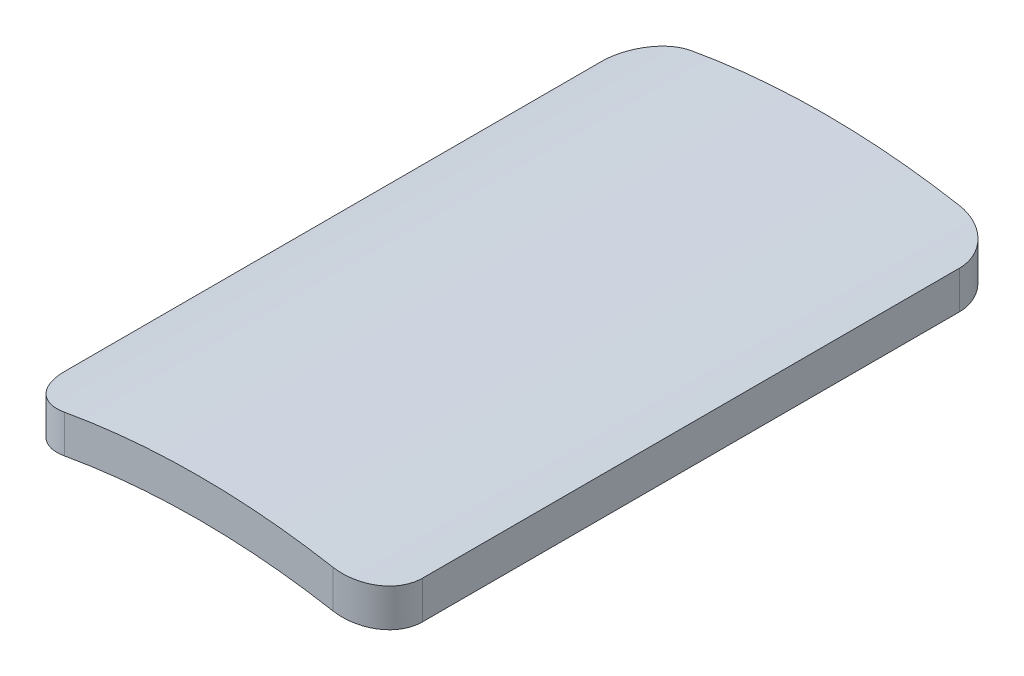
ISO-10303-21;
HEADER;
FILE_DESCRIPTION(('STEP AP214'),'2;1');
FILE_NAME('part.step','',(''),(''),'','','');
FILE_SCHEMA(('AUTOMOTIVE_DESIGN { 1 0 10303 214 1 1 1 1 }'));
ENDSEC;
DATA;
#1=APPLICATION_CONTEXT('core data for automotive mechanical design processes');
#2=APPLICATION_PROTOCOL_DEFINITION('international standard','automotive_design',2000,#1);
#3=PRODUCT_CONTEXT('',#1,'mechanical');
#4=PRODUCT('Part','Part','',(#3));
#5=PRODUCT_RELATED_PRODUCT_CATEGORY('part','',(#4));
#6=PRODUCT_DEFINITION_FORMATION('','',#4);
#7=PRODUCT_DEFINITION_CONTEXT('part definition',#1,'design');
#8=PRODUCT_DEFINITION('design','',#6,#7);
#9=PRODUCT_DEFINITION_SHAPE('','',#8);
#10=(LENGTH_UNIT() NAMED_UNIT(*) SI_UNIT(.MILLI.,.METRE.));
#11=(NAMED_UNIT(*) PLANE_ANGLE_UNIT() SI_UNIT($,.RADIAN.));
#12=(NAMED_UNIT(*) SI_UNIT($,.STERADIAN.) SOLID_ANGLE_UNIT());
#13=UNCERTAINTY_MEASURE_WITH_UNIT(LENGTH_MEASURE(1.E-05),#10,'distance_accuracy_value','');
#14=(GEOMETRIC_REPRESENTATION_CONTEXT(3) GLOBAL_UNCERTAINTY_ASSIGNED_CONTEXT((#13)) GLOBAL_UNIT_ASSIGNED_CONTEXT((#10,
#11,#12)) REPRESENTATION_CONTEXT('',''));
#15=CARTESIAN_POINT('',(0.,0.,0.));
#16=DIRECTION('',(0.,0.,1.));
#17=DIRECTION('',(1.,0.,0.));
#18=AXIS2_PLACEMENT_3D('',#15,#16,#17);
#19=CARTESIAN_POINT('',(0.,12.6999999999999,210.));
#20=DIRECTION('',(0.,0.,-1.));
#21=DIRECTION('',(-1.,0.,0.));
#22=AXIS2_PLACEMENT_3D('',#19,#20,#21);
#23=CYLINDRICAL_SURFACE('',#22,254.);
#24=DIRECTION('',(0.,0.,-1.));
#25=VECTOR('',#24,1.);
#26=CARTESIAN_POINT('',(60.0000000000001,259.511669092043,210.));
#27=LINE('',#26,#25);
#28=CARTESIAN_POINT('',(60.0000000000001,259.511669092043,195.));
#29=VERTEX_POINT('',#28);
#30=CARTESIAN_POINT('',(60.0000000000001,259.511669092043,15.));
#31=VERTEX_POINT('',#30);
#32=EDGE_CURVE('E109',#29,#31,#27,.T.);
#33=ORIENTED_EDGE('',*,*,#32,.T.);
#34=CARTESIAN_POINT('',(60.0000000000001,259.511669092043,15.));
#35=CARTESIAN_POINT('',(60.0000001541794,259.51166867937,14.7930484848678));
#36=CARTESIAN_POINT('',(59.9957163818266,259.512710488905,14.5861226501861));
#37=CARTESIAN_POINT('',(59.9785950952646,259.516871875848,14.1726475265372));
#38=CARTESIAN_POINT('',(59.9657576408849,259.519991438723,13.9660982349463));
#39=CARTESIAN_POINT('',(59.9144474939262,259.53245393191,13.347639174869));
#40=CARTESIAN_POINT('',(59.863176996449,259.544900676074,12.9367766933484));
#41=CARTESIAN_POINT('',(59.7270532099312,259.577872587751,12.1217380458237));
#42=CARTESIAN_POINT('',(59.6422553459561,259.598384422319,11.7175519858969));
#43=CARTESIAN_POINT('',(59.4397750877445,259.647208883795,10.9179720752957));
#44=CARTESIAN_POINT('',(59.3220926375575,259.675521523975,10.5225782395819));
#45=CARTESIAN_POINT('',(59.0547854199646,259.739574137433,9.74331719380976));
#46=CARTESIAN_POINT('',(58.9051569820494,259.775314964178,9.35945131406901));
#47=CARTESIAN_POINT('',(58.5751523710863,259.853758355402,8.6059071102114));
#48=CARTESIAN_POINT('',(58.3947756484712,259.89646104431,8.2362290398194));
#49=CARTESIAN_POINT('',(58.0046607614306,259.988292212507,7.51351632243513));
#50=CARTESIAN_POINT('',(57.794920793518,260.037421086479,7.16048269952465));
#51=CARTESIAN_POINT('',(57.3476657943594,260.14150404459,6.47338337486023));
#52=CARTESIAN_POINT('',(57.1101505738148,260.19645816843,6.13931780240358));
#53=CARTESIAN_POINT('',(56.6055769936013,260.312351403797,5.48775922496414));
#54=CARTESIAN_POINT('',(56.3381523527347,260.373363384628,5.17056284168507));
#55=CARTESIAN_POINT('',(55.778476451731,260.500007792394,4.55988535454695));
#56=CARTESIAN_POINT('',(55.4862249066143,260.565640272364,4.26640452298632));
#57=CARTESIAN_POINT('',(54.8788926943659,260.700814347405,3.70493266901083));
#58=CARTESIAN_POINT('',(54.5638065289835,260.770356883052,3.43694782183136));
#59=CARTESIAN_POINT('',(53.9130457262882,260.912599226453,2.9282064892944));
#60=CARTESIAN_POINT('',(53.5773710327311,260.985299042833,2.68745007832504));
#61=CARTESIAN_POINT('',(52.8789467609822,261.134996979243,2.22889560553249));
#62=CARTESIAN_POINT('',(52.5157264735411,261.212057347178,2.01183450881089));
#63=CARTESIAN_POINT('',(51.7725452212415,261.367946662358,1.60928583385435));
#64=CARTESIAN_POINT('',(51.39258380449,261.446775657316,1.4237991085638));
#65=CARTESIAN_POINT('',(50.618677620439,261.605414676664,1.08566435619933));
#66=CARTESIAN_POINT('',(50.2247373797523,261.685224378109,0.933005809762937));
#67=CARTESIAN_POINT('',(49.4254870919643,261.845112745394,0.661481210046061));
#68=CARTESIAN_POINT('',(49.0201792768898,261.925191355753,0.542608573225225));
#69=CARTESIAN_POINT('',(48.3156535427702,262.062563413024,0.367883533586442));
#70=CARTESIAN_POINT('',(48.0184909892975,262.119961388578,0.303704623937117));
#71=CARTESIAN_POINT('',(47.420740362565,262.234298157293,0.193502926802259));
#72=CARTESIAN_POINT('',(47.1201525797222,262.291236988694,0.147478611645022));
#73=CARTESIAN_POINT('',(46.5169924469798,262.404351888161,0.073817987090146));
#74=CARTESIAN_POINT('',(46.2144230844473,262.46052882908,0.04615851793122));
#75=CARTESIAN_POINT('',(45.6079379876144,262.571990135916,0.00924263422101381));
#76=CARTESIAN_POINT('',(45.3040219972827,262.627274321924,-1.01157437972733E-05));
#77=CARTESIAN_POINT('',(45.0000000000001,262.681999351953,0.));
#78=B_SPLINE_CURVE_WITH_KNOTS('',3,(#34,#35,#36,#37,#38,#39,#40,#41,#42,#43,#44,#45,#46,#47,#48,
#49,#50,#51,#52,#53,#54,#55,#56,#57,#58,#59,#60,#61,#62,#63,#64,#65,#66,#67,#68,#69,#70,#71,#72,
#73,#74,#75,#76,#77),.UNSPECIFIED.,.F.,.F.,(4,2,2,2,2,2,2,2,2,2,2,2,2,2,2,2,2,2,2,2,2,4),(0.,
0.620756384816884,1.24150842775672,2.48258932108984,3.72162706865398,4.96066692435903,
6.19984921914479,7.43905366428252,8.67833425463271,9.91762329162678,11.1742207186125,
12.4308325716133,13.6877480106077,14.9446668834145,16.2334577804403,17.5222834871083,
18.8106955889249,20.0988564576756,21.0264985534749,21.9540625734435,22.8804546167443,
23.8070310766212),.UNSPECIFIED.);
#79=CARTESIAN_POINT('',(45.0000000000001,262.681999351953,0.));
#80=VERTEX_POINT('',#79);
#81=EDGE_CURVE('E167',#31,#80,#78,.T.);
#82=ORIENTED_EDGE('',*,*,#81,.T.);
#83=CARTESIAN_POINT('',(0.,12.6999999999999,0.));
#84=DIRECTION('',(0.,0.,1.));
#85=DIRECTION('',(1.,0.,0.));
#86=AXIS2_PLACEMENT_3D('',#83,#84,#85);
#87=CIRCLE('',#86,254.);
#88=CARTESIAN_POINT('',(-45.0000000000001,262.681999351953,0.));
#89=VERTEX_POINT('',#88);
#90=EDGE_CURVE('E216',#80,#89,#87,.T.);
#91=ORIENTED_EDGE('',*,*,#90,.T.);
#92=CARTESIAN_POINT('',(-45.0000000000001,262.681999351953,0.));
#93=CARTESIAN_POINT('',(-45.4294376858986,262.604706476596,-4.15526219416858E-05));
#94=CARTESIAN_POINT('',(-45.8586585995018,262.526287639836,0.0184397316181787));
#95=CARTESIAN_POINT('',(-46.7136179739125,262.367830053483,0.0920404783760814));
#96=CARTESIAN_POINT('',(-47.1393566693072,262.287791414295,0.147157451924801));
#97=CARTESIAN_POINT('',(-47.9841383707825,262.126758164133,0.293583448301594));
#98=CARTESIAN_POINT('',(-48.4031847995897,262.04576408124,0.384873311004959));
#99=CARTESIAN_POINT('',(-49.2318714323198,261.883468556722,0.602958270625843));
#100=CARTESIAN_POINT('',(-49.6415116666793,261.802167116091,0.729753252638825));
#101=CARTESIAN_POINT('',(-50.4486730159223,261.639954526512,1.01802253217642));
#102=CARTESIAN_POINT('',(-50.8461892623375,261.559043545053,1.17951055688413));
#103=CARTESIAN_POINT('',(-51.6261295029793,261.398414329781,1.53603847527787));
#104=CARTESIAN_POINT('',(-52.0085535743438,261.318696089873,1.73107819744978));
#105=CARTESIAN_POINT('',(-52.7555331534634,261.161263405664,2.15337579832397));
#106=CARTESIAN_POINT('',(-53.1200914721124,261.083548647066,2.38062858676693));
#107=CARTESIAN_POINT('',(-53.8287715548229,260.930930297364,2.86586576061533));
#108=CARTESIAN_POINT('',(-54.1728934749816,260.85602668479,3.12384991124317));
#109=CARTESIAN_POINT('',(-54.8374336887313,260.710022710099,3.668231998109));
#110=CARTESIAN_POINT('',(-55.157903087529,260.638914245888,3.95456534548008));
#111=CARTESIAN_POINT('',(-55.7735696910984,260.501147023288,4.55419347775247));
#112=CARTESIAN_POINT('',(-56.0687667143355,260.434488296862,4.86748845629011));
#113=CARTESIAN_POINT('',(-56.631695424,260.306410311331,5.51902081185908));
#114=CARTESIAN_POINT('',(-56.8994227514114,260.244991884039,5.85726213289706));
#115=CARTESIAN_POINT('',(-57.2786684542124,260.15741245942,6.38136632626339));
#116=CARTESIAN_POINT('',(-57.4013630308583,260.128976519476,6.55886402125944));
#117=CARTESIAN_POINT('',(-57.6391231454316,260.073697826896,6.91920957596575));
#118=CARTESIAN_POINT('',(-57.7541865944734,260.046855510695,7.10205888100373));
#119=CARTESIAN_POINT('',(-58.0833582975446,259.969839818797,7.65115644336909));
#120=CARTESIAN_POINT('',(-58.2862299116384,259.922070653442,8.02457232252576));
#121=CARTESIAN_POINT('',(-58.6598124449476,259.833695144002,8.78790322010142));
#122=CARTESIAN_POINT('',(-58.8305241810681,259.793088617977,9.17781781912211));
#123=CARTESIAN_POINT('',(-59.1382797429383,259.71961239335,9.97109895078273));
#124=CARTESIAN_POINT('',(-59.2753498457593,259.686736657168,10.3744547031871));
#125=CARTESIAN_POINT('',(-59.5147664288372,259.629155247017,11.1917321107843));
#126=CARTESIAN_POINT('',(-59.6171237425834,259.604447024114,11.6056504260718));
#127=CARTESIAN_POINT('',(-59.8007900949181,259.560033406785,12.5128857047575));
#128=CARTESIAN_POINT('',(-59.8754836471939,259.541911557436,13.0076506714157));
#129=CARTESIAN_POINT('',(-59.9501806802361,259.523775970581,13.7532021150467));
#130=CARTESIAN_POINT('',(-59.9688557874932,259.519238651207,14.00215859031));
#131=CARTESIAN_POINT('',(-59.9937650541103,259.513184920042,14.5007267503782));
#132=CARTESIAN_POINT('',(-59.9999993645814,259.511668471558,14.7503384271879));
#133=CARTESIAN_POINT('',(-60.0000000000001,259.511669092043,15.));
#134=B_SPLINE_CURVE_WITH_KNOTS('',3,(#92,#93,#94,#95,#96,#97,#98,#99,#100,#101,#102,#103,#104,
#105,#106,#107,#108,#109,#110,#111,#112,#113,#114,#115,#116,#117,#118,#119,#120,#121,#122,#123,
#124,#125,#126,#127,#128,#129,#130,#131,#132,#133),.UNSPECIFIED.,.F.,.F.,(4,2,2,2,2,2,2,2,2,2,2,
2,2,2,2,2,2,2,2,2,4),(0.,1.3086019086928,2.61711492218899,3.92493576454784,5.23275237448009,
6.54108741146777,7.84941576052961,9.15753759954329,10.4656494455727,11.7708467156053,
13.076053360245,14.3814668017068,15.0342151643604,15.6871414740206,16.968358780115,
18.2495435371428,19.5297243685856,20.8095053008502,22.3086580764339,23.0574700448827,
23.8062729178976),.UNSPECIFIED.);
#135=CARTESIAN_POINT('',(-60.0000000000001,259.511669092043,15.));
#136=VERTEX_POINT('',#135);
#137=EDGE_CURVE('E162',#89,#136,#134,.T.);
#138=ORIENTED_EDGE('',*,*,#137,.T.);
#139=DIRECTION('',(0.,0.,-1.));
#140=VECTOR('',#139,1.);
#141=CARTESIAN_POINT('',(-60.0000000000001,259.511669092043,210.));
#142=LINE('',#141,#140);
#143=CARTESIAN_POINT('',(-60.0000000000001,259.511669092043,195.));
#144=VERTEX_POINT('',#143);
#145=EDGE_CURVE('E131',#144,#136,#142,.T.);
#146=ORIENTED_EDGE('',*,*,#145,.F.);
#147=CARTESIAN_POINT('',(-60.0000000000001,259.511669092043,195.));
#148=CARTESIAN_POINT('',(-60.0000001541795,259.51166867937,195.206951515132));
#149=CARTESIAN_POINT('',(-59.9957163818266,259.512710488905,195.413877349814));
#150=CARTESIAN_POINT('',(-59.9785950952647,259.516871875848,195.827352473463));
#151=CARTESIAN_POINT('',(-59.965757640885,259.519991438723,196.033901765054));
#152=CARTESIAN_POINT('',(-59.9144474939262,259.53245393191,196.652360825131));
#153=CARTESIAN_POINT('',(-59.863176996449,259.544900676074,197.063223306652));
#154=CARTESIAN_POINT('',(-59.7270532099313,259.577872587751,197.878261954176));
#155=CARTESIAN_POINT('',(-59.6422553459561,259.598384422319,198.282448014103));
#156=CARTESIAN_POINT('',(-59.4397750877445,259.647208883795,199.082027924704));
#157=CARTESIAN_POINT('',(-59.3220926375575,259.675521523975,199.477421760418));
#158=CARTESIAN_POINT('',(-59.0547854199646,259.739574137433,200.25668280619));
#159=CARTESIAN_POINT('',(-58.9051569820495,259.775314964178,200.640548685931));
#160=CARTESIAN_POINT('',(-58.5751523710864,259.853758355402,201.394092889789));
#161=CARTESIAN_POINT('',(-58.3947756484712,259.89646104431,201.763770960181));
#162=CARTESIAN_POINT('',(-58.0046607614307,259.988292212507,202.486483677565));
#163=CARTESIAN_POINT('',(-57.7949207935181,260.037421086479,202.839517300475));
#164=CARTESIAN_POINT('',(-57.3476657943595,260.14150404459,203.52661662514));
#165=CARTESIAN_POINT('',(-57.1101505738149,260.19645816843,203.860682197596));
#166=CARTESIAN_POINT('',(-56.6055769936014,260.312351403797,204.512240775036));
#167=CARTESIAN_POINT('',(-56.3381523527347,260.373363384628,204.829437158315));
#168=CARTESIAN_POINT('',(-55.7784764517311,260.500007792393,205.440114645453));
#169=CARTESIAN_POINT('',(-55.4862249066143,260.565640272364,205.733595477014));
#170=CARTESIAN_POINT('',(-54.8788926943659,260.700814347405,206.295067330989));
#171=CARTESIAN_POINT('',(-54.5638065289836,260.770356883052,206.563052178169));
#172=CARTESIAN_POINT('',(-53.9130457262882,260.912599226453,207.071793510706));
#173=CARTESIAN_POINT('',(-53.5773710327311,260.985299042833,207.312549921675));
#174=CARTESIAN_POINT('',(-52.8789467609823,261.134996979243,207.771104394467));
#175=CARTESIAN_POINT('',(-52.5157264735412,261.212057347178,207.988165491189));
#176=CARTESIAN_POINT('',(-51.7725452212415,261.367946662358,208.390714166146));
#177=CARTESIAN_POINT('',(-51.39258380449,261.446775657316,208.576200891436));
#178=CARTESIAN_POINT('',(-50.6186776204391,261.605414676664,208.914335643801));
#179=CARTESIAN_POINT('',(-50.2247373797523,261.685224378109,209.066994190237));
#180=CARTESIAN_POINT('',(-49.4254870919644,261.845112745394,209.338518789954));
#181=CARTESIAN_POINT('',(-49.0201792768899,261.925191355753,209.457391426775));
#182=CARTESIAN_POINT('',(-48.3156535427703,262.062563413024,209.632116466414));
#183=CARTESIAN_POINT('',(-48.0184909892976,262.119961388578,209.696295376063));
#184=CARTESIAN_POINT('',(-47.4207403625651,262.234298157293,209.806497073198));
#185=CARTESIAN_POINT('',(-47.1201525797223,262.291236988694,209.852521388355));
#186=CARTESIAN_POINT('',(-46.5169924469798,262.404351888161,209.92618201291));
#187=CARTESIAN_POINT('',(-46.2144230844473,262.46052882908,209.953841482069));
#188=CARTESIAN_POINT('',(-45.6079379876144,262.571990135916,209.990757365779));
#189=CARTESIAN_POINT('',(-45.3040219972827,262.627274321924,210.000010115744));
#190=CARTESIAN_POINT('',(-45.0000000000001,262.681999351953,210.));
#191=B_SPLINE_CURVE_WITH_KNOTS('',3,(#147,#148,#149,#150,#151,#152,#153,#154,#155,#156,#157,
#158,#159,#160,#161,#162,#163,#164,#165,#166,#167,#168,#169,#170,#171,#172,#173,#174,#175,#176,
#177,#178,#179,#180,#181,#182,#183,#184,#185,#186,#187,#188,#189,#190),.UNSPECIFIED.,.F.,.F.,(4,
2,2,2,2,2,2,2,2,2,2,2,2,2,2,2,2,2,2,2,2,4),(0.,0.62075638481688,1.24150842775672,
2.48258932108982,3.72162706865396,4.96066692435902,6.1998492191448,7.43905366428251,
8.67833425463267,9.91762329162676,11.1742207186125,12.4308325716133,13.6877480106077,
14.9446668834145,16.2334577804403,17.5222834871083,18.8106955889249,20.0988564576756,
21.0264985534749,21.9540625734435,22.8804546167443,23.8070310766212),.UNSPECIFIED.);
#192=CARTESIAN_POINT('',(-45.0000000000001,262.681999351953,210.));
#193=VERTEX_POINT('',#192);
#194=EDGE_CURVE('E116',#144,#193,#191,.T.);
#195=ORIENTED_EDGE('',*,*,#194,.T.);
#196=CARTESIAN_POINT('',(0.,12.6999999999999,210.));
#197=DIRECTION('',(0.,0.,1.));
#198=DIRECTION('',(1.,0.,0.));
#199=AXIS2_PLACEMENT_3D('',#196,#197,#198);
#200=CIRCLE('',#199,254.);
#201=CARTESIAN_POINT('',(45.0000000000001,262.681999351953,210.));
#202=VERTEX_POINT('',#201);
#203=EDGE_CURVE('E111',#202,#193,#200,.T.);
#204=ORIENTED_EDGE('',*,*,#203,.F.);
#205=CARTESIAN_POINT('',(45.0000000000001,262.681999351953,210.));
#206=CARTESIAN_POINT('',(45.4294376858986,262.604706476595,210.000041552622));
#207=CARTESIAN_POINT('',(45.8586585995018,262.526287639836,209.981560268382));
#208=CARTESIAN_POINT('',(46.7136179739125,262.367830053483,209.907959521624));
#209=CARTESIAN_POINT('',(47.1393566693072,262.287791414295,209.852842548075));
#210=CARTESIAN_POINT('',(47.9841383707825,262.126758164133,209.706416551698));
#211=CARTESIAN_POINT('',(48.4031847995896,262.04576408124,209.615126688995));
#212=CARTESIAN_POINT('',(49.2318714323198,261.883468556722,209.397041729374));
#213=CARTESIAN_POINT('',(49.6415116666793,261.802167116091,209.270246747361));
#214=CARTESIAN_POINT('',(50.4486730159223,261.639954526512,208.981977467824));
#215=CARTESIAN_POINT('',(50.8461892623375,261.559043545053,208.820489443116));
#216=CARTESIAN_POINT('',(51.6261295029792,261.398414329781,208.463961524722));
#217=CARTESIAN_POINT('',(52.0085535743438,261.318696089873,208.26892180255));
#218=CARTESIAN_POINT('',(52.7555331534633,261.161263405664,207.846624201676));
#219=CARTESIAN_POINT('',(53.1200914721124,261.083548647066,207.619371413233));
#220=CARTESIAN_POINT('',(53.8287715548228,260.930930297364,207.134134239385));
#221=CARTESIAN_POINT('',(54.1728934749815,260.85602668479,206.876150088757));
#222=CARTESIAN_POINT('',(54.8374336887312,260.710022710099,206.331768001891));
#223=CARTESIAN_POINT('',(55.1579030875289,260.638914245888,206.04543465452));
#224=CARTESIAN_POINT('',(55.7735696910983,260.501147023288,205.445806522248));
#225=CARTESIAN_POINT('',(56.0687667143355,260.434488296862,205.13251154371));
#226=CARTESIAN_POINT('',(56.6316954239999,260.306410311331,204.480979188141));
#227=CARTESIAN_POINT('',(56.8994227514114,260.244991884039,204.142737867103));
#228=CARTESIAN_POINT('',(57.2786684542123,260.15741245942,203.618633673737));
#229=CARTESIAN_POINT('',(57.4013630308582,260.128976519476,203.441135978741));
#230=CARTESIAN_POINT('',(57.6391231454315,260.073697826896,203.080790424034));
#231=CARTESIAN_POINT('',(57.7541865944734,260.046855510696,202.897941118996));
#232=CARTESIAN_POINT('',(58.0833582975446,259.969839818797,202.348843556631));
#233=CARTESIAN_POINT('',(58.2862299116383,259.922070653442,201.975427677474));
#234=CARTESIAN_POINT('',(58.6598124449475,259.833695144002,201.212096779899));
#235=CARTESIAN_POINT('',(58.830524181068,259.793088617977,200.822182180878));
#236=CARTESIAN_POINT('',(59.1382797429382,259.71961239335,200.028901049217));
#237=CARTESIAN_POINT('',(59.2753498457592,259.686736657168,199.625545296813));
#238=CARTESIAN_POINT('',(59.5147664288371,259.629155247017,198.808267889216));
#239=CARTESIAN_POINT('',(59.6171237425834,259.604447024114,198.394349573928));
#240=CARTESIAN_POINT('',(59.800790094918,259.560033406785,197.487114295243));
#241=CARTESIAN_POINT('',(59.8754836471939,259.541911557436,196.992349328584));
#242=CARTESIAN_POINT('',(59.9501806802361,259.523775970581,196.246797884953));
#243=CARTESIAN_POINT('',(59.9688557874931,259.519238651207,195.99784140969));
#244=CARTESIAN_POINT('',(59.9937650541102,259.513184920042,195.499273249622));
#245=CARTESIAN_POINT('',(59.9999993645813,259.511668471558,195.249661572812));
#246=CARTESIAN_POINT('',(60.,259.511669092043,195.));
#247=B_SPLINE_CURVE_WITH_KNOTS('',3,(#205,#206,#207,#208,#209,#210,#211,#212,#213,#214,#215,
#216,#217,#218,#219,#220,#221,#222,#223,#224,#225,#226,#227,#228,#229,#230,#231,#232,#233,#234,
#235,#236,#237,#238,#239,#240,#241,#242,#243,#244,#245,#246),.UNSPECIFIED.,.F.,.F.,(4,2,2,2,2,2,
2,2,2,2,2,2,2,2,2,2,2,2,2,2,4),(0.,1.30860190869279,2.61711492218898,3.92493576454782,
5.23275237448008,6.54108741146776,7.84941576052956,9.15753759954325,10.4656494455727,
11.7708467156053,13.0760533602449,14.3814668017067,15.0342151643603,15.6871414740205,
16.968358780115,18.2495435371427,19.5297243685855,20.8095053008502,22.3086580764339,
23.0574700448827,23.8062729178976),.UNSPECIFIED.);
#248=EDGE_CURVE('E107',#202,#29,#247,.T.);
#249=ORIENTED_EDGE('',*,*,#248,.T.);
#250=EDGE_LOOP('',(#33,#82,#91,#138,#146,#195,#204,#249));
#251=FACE_BOUND('',#250,.T.);
#252=ADVANCED_FACE('F39',(#251),#23,.T.);
#253=CARTESIAN_POINT('',(-60.0000000000001,259.511669092043,210.));
#254=DIRECTION('',(1.,0.,0.));
#255=DIRECTION('',(0.,0.,-1.));
#256=AXIS2_PLACEMENT_3D('',#253,#254,#255);
#257=PLANE('',#256);
#258=ORIENTED_EDGE('',*,*,#145,.T.);
#259=DIRECTION('',(0.,-1.,0.));
#260=VECTOR('',#259,1.);
#261=CARTESIAN_POINT('',(-60.0000000000001,259.511669092043,15.));
#262=LINE('',#261,#260);
#263=CARTESIAN_POINT('',(-60.0000000000001,246.811669092043,15.));
#264=VERTEX_POINT('',#263);
#265=EDGE_CURVE('E226',#136,#264,#262,.T.);
#266=ORIENTED_EDGE('',*,*,#265,.T.);
#267=DIRECTION('',(0.,0.,-1.));
#268=VECTOR('',#267,1.);
#269=CARTESIAN_POINT('',(-60.0000000000001,246.811669092043,210.));
#270=LINE('',#269,#268);
#271=CARTESIAN_POINT('',(-60.0000000000001,246.811669092043,195.));
#272=VERTEX_POINT('',#271);
#273=EDGE_CURVE('E135',#272,#264,#270,.T.);
#274=ORIENTED_EDGE('',*,*,#273,.F.);
#275=DIRECTION('',(0.,-1.,0.));
#276=VECTOR('',#275,1.);
#277=CARTESIAN_POINT('',(-60.0000000000001,259.511669092043,195.));
#278=LINE('',#277,#276);
#279=EDGE_CURVE('E225',#272,#144,#278,.F.);
#280=ORIENTED_EDGE('',*,*,#279,.T.);
#281=EDGE_LOOP('',(#258,#266,#274,#280));
#282=FACE_BOUND('',#281,.T.);
#283=ADVANCED_FACE('F153',(#282),#257,.F.);
#284=CARTESIAN_POINT('',(0.,0.,210.));
#285=DIRECTION('',(0.,0.,-1.));
#286=DIRECTION('',(-1.,0.,0.));
#287=AXIS2_PLACEMENT_3D('',#284,#285,#286);
#288=CYLINDRICAL_SURFACE('',#287,254.);
#289=CARTESIAN_POINT('',(0.,0.,0.));
#290=DIRECTION('',(0.,0.,-1.));
#291=DIRECTION('',(1.,0.,0.));
#292=AXIS2_PLACEMENT_3D('',#289,#290,#291);
#293=CIRCLE('',#292,254.);
#294=CARTESIAN_POINT('',(-45.0000000000001,249.981999351953,0.));
#295=VERTEX_POINT('',#294);
#296=CARTESIAN_POINT('',(45.,249.981999351953,0.));
#297=VERTEX_POINT('',#296);
#298=EDGE_CURVE('E222',#295,#297,#293,.T.);
#299=ORIENTED_EDGE('',*,*,#298,.T.);
#300=CARTESIAN_POINT('',(45.,249.981999351953,0.));
#301=CARTESIAN_POINT('',(45.4294376858985,249.904706476595,-4.1552621942158E-05));
#302=CARTESIAN_POINT('',(45.8586585995017,249.826287639836,0.0184397316181786));
#303=CARTESIAN_POINT('',(46.7136179739124,249.667830053483,0.0920404783760822));
#304=CARTESIAN_POINT('',(47.1393566693072,249.587791414295,0.147157451924802));
#305=CARTESIAN_POINT('',(47.9841383707824,249.426758164133,0.293583448301595));
#306=CARTESIAN_POINT('',(48.4031847995896,249.34576408124,0.384873311004958));
#307=CARTESIAN_POINT('',(49.2318714323198,249.183468556722,0.602958270625841));
#308=CARTESIAN_POINT('',(49.6415116666792,249.102167116091,0.729753252638825));
#309=CARTESIAN_POINT('',(50.4486730159222,248.939954526512,1.01802253217643));
#310=CARTESIAN_POINT('',(50.8461892623374,248.859043545053,1.17951055688414));
#311=CARTESIAN_POINT('',(51.6261295029792,248.698414329781,1.53603847527787));
#312=CARTESIAN_POINT('',(52.0085535743438,248.618696089873,1.73107819744977));
#313=CARTESIAN_POINT('',(52.7555331534633,248.461263405664,2.15337579832397));
#314=CARTESIAN_POINT('',(53.1200914721124,248.383548647066,2.38062858676692));
#315=CARTESIAN_POINT('',(53.8287715548228,248.230930297364,2.86586576061533));
#316=CARTESIAN_POINT('',(54.1728934749815,248.15602668479,3.12384991124318));
#317=CARTESIAN_POINT('',(54.8374336887312,248.010022710099,3.668231998109));
#318=CARTESIAN_POINT('',(55.1579030875289,247.938914245888,3.95456534548006));
#319=CARTESIAN_POINT('',(55.7735696910983,247.801147023288,4.55419347775245));
#320=CARTESIAN_POINT('',(56.0687667143354,247.734488296862,4.8674884562901));
#321=CARTESIAN_POINT('',(56.6316954239999,247.606410311331,5.51902081185908));
#322=CARTESIAN_POINT('',(56.8994227514114,247.544991884039,5.85726213289705));
#323=CARTESIAN_POINT('',(57.2786684542123,247.45741245942,6.38136632626339));
#324=CARTESIAN_POINT('',(57.4013630308582,247.428976519476,6.55886402125943));
#325=CARTESIAN_POINT('',(57.6391231454315,247.373697826896,6.91920957596574));
#326=CARTESIAN_POINT('',(57.7541865944734,247.346855510696,7.10205888100371));
#327=CARTESIAN_POINT('',(58.0833582975446,247.269839818797,7.65115644336908));
#328=CARTESIAN_POINT('',(58.2862299116383,247.222070653442,8.02457232252575));
#329=CARTESIAN_POINT('',(58.6598124449475,247.133695144002,8.78790322010142));
#330=CARTESIAN_POINT('',(58.830524181068,247.093088617977,9.17781781912211));
#331=CARTESIAN_POINT('',(59.1382797429382,247.01961239335,9.97109895078273));
#332=CARTESIAN_POINT('',(59.2753498457592,246.986736657168,10.3744547031871));
#333=CARTESIAN_POINT('',(59.5147664288371,246.929155247017,11.1917321107843));
#334=CARTESIAN_POINT('',(59.6171237425833,246.904447024114,11.6056504260718));
#335=CARTESIAN_POINT('',(59.800790094918,246.860033406785,12.5128857047575));
#336=CARTESIAN_POINT('',(59.8754836471939,246.841911557436,13.0076506714157));
#337=CARTESIAN_POINT('',(59.950180680236,246.823775970581,13.7532021150467));
#338=CARTESIAN_POINT('',(59.9688557874931,246.819238651207,14.00215859031));
#339=CARTESIAN_POINT('',(59.9937650541102,246.813184920042,14.5007267503783));
#340=CARTESIAN_POINT('',(59.9999993645813,246.811668471558,14.7503384271879));
#341=CARTESIAN_POINT('',(60.,246.811669092043,15.));
#342=B_SPLINE_CURVE_WITH_KNOTS('',3,(#300,#301,#302,#303,#304,#305,#306,#307,#308,#309,#310,
#311,#312,#313,#314,#315,#316,#317,#318,#319,#320,#321,#322,#323,#324,#325,#326,#327,#328,#329,
#330,#331,#332,#333,#334,#335,#336,#337,#338,#339,#340,#341),.UNSPECIFIED.,.F.,.F.,(4,2,2,2,2,2,
2,2,2,2,2,2,2,2,2,2,2,2,2,2,4),(0.,1.3086019086928,2.61711492218899,3.92493576454783,
5.23275237448009,6.54108741146777,7.8494157605296,9.15753759954328,10.4656494455727,
11.7708467156053,13.0760533602449,14.3814668017068,15.0342151643604,15.6871414740205,
16.968358780115,18.2495435371428,19.5297243685856,20.8095053008502,22.3086580764339,
23.0574700448827,23.8062729178976),.UNSPECIFIED.);
#343=CARTESIAN_POINT('',(60.,246.811669092043,15.));
#344=VERTEX_POINT('',#343);
#345=EDGE_CURVE('E186',#297,#344,#342,.T.);
#346=ORIENTED_EDGE('',*,*,#345,.T.);
#347=DIRECTION('',(0.,0.,-1.));
#348=VECTOR('',#347,1.);
#349=CARTESIAN_POINT('',(60.,246.811669092043,210.));
#350=LINE('',#349,#348);
#351=CARTESIAN_POINT('',(60.,246.811669092043,195.));
#352=VERTEX_POINT('',#351);
#353=EDGE_CURVE('E126',#352,#344,#350,.T.);
#354=ORIENTED_EDGE('',*,*,#353,.F.);
#355=CARTESIAN_POINT('',(60.,246.811669092043,195.));
#356=CARTESIAN_POINT('',(60.0000001541794,246.81166867937,195.206951515132));
#357=CARTESIAN_POINT('',(59.9957163818265,246.812710488905,195.413877349814));
#358=CARTESIAN_POINT('',(59.9785950952646,246.816871875848,195.827352473463));
#359=CARTESIAN_POINT('',(59.9657576408849,246.819991438723,196.033901765054));
#360=CARTESIAN_POINT('',(59.9144474939261,246.83245393191,196.652360825131));
#361=CARTESIAN_POINT('',(59.8631769964489,246.844900676074,197.063223306652));
#362=CARTESIAN_POINT('',(59.7270532099312,246.877872587751,197.878261954176));
#363=CARTESIAN_POINT('',(59.642255345956,246.898384422319,198.282448014103));
#364=CARTESIAN_POINT('',(59.4397750877445,246.947208883795,199.082027924704));
#365=CARTESIAN_POINT('',(59.3220926375574,246.975521523975,199.477421760418));
#366=CARTESIAN_POINT('',(59.0547854199645,247.039574137433,200.25668280619));
#367=CARTESIAN_POINT('',(58.9051569820494,247.075314964178,200.640548685931));
#368=CARTESIAN_POINT('',(58.5751523710863,247.153758355402,201.394092889789));
#369=CARTESIAN_POINT('',(58.3947756484711,247.19646104431,201.763770960181));
#370=CARTESIAN_POINT('',(58.0046607614306,247.288292212507,202.486483677565));
#371=CARTESIAN_POINT('',(57.794920793518,247.337421086479,202.839517300475));
#372=CARTESIAN_POINT('',(57.3476657943594,247.44150404459,203.52661662514));
#373=CARTESIAN_POINT('',(57.1101505738148,247.49645816843,203.860682197596));
#374=CARTESIAN_POINT('',(56.6055769936013,247.612351403797,204.512240775036));
#375=CARTESIAN_POINT('',(56.3381523527346,247.673363384628,204.829437158315));
#376=CARTESIAN_POINT('',(55.778476451731,247.800007792394,205.440114645453));
#377=CARTESIAN_POINT('',(55.4862249066142,247.865640272364,205.733595477014));
#378=CARTESIAN_POINT('',(54.8788926943658,248.000814347405,206.295067330989));
#379=CARTESIAN_POINT('',(54.5638065289835,248.070356883052,206.563052178169));
#380=CARTESIAN_POINT('',(53.9130457262881,248.212599226453,207.071793510706));
#381=CARTESIAN_POINT('',(53.577371032731,248.285299042833,207.312549921675));
#382=CARTESIAN_POINT('',(52.8789467609822,248.434996979243,207.771104394467));
#383=CARTESIAN_POINT('',(52.5157264735411,248.512057347178,207.988165491189));
#384=CARTESIAN_POINT('',(51.7725452212414,248.667946662358,208.390714166146));
#385=CARTESIAN_POINT('',(51.3925838044899,248.746775657316,208.576200891436));
#386=CARTESIAN_POINT('',(50.618677620439,248.905414676664,208.914335643801));
#387=CARTESIAN_POINT('',(50.2247373797522,248.985224378109,209.066994190237));
#388=CARTESIAN_POINT('',(49.4254870919643,249.145112745394,209.338518789954));
#389=CARTESIAN_POINT('',(49.0201792768898,249.225191355753,209.457391426775));
#390=CARTESIAN_POINT('',(48.3156535427702,249.362563413024,209.632116466414));
#391=CARTESIAN_POINT('',(48.0184909892975,249.419961388578,209.696295376063));
#392=CARTESIAN_POINT('',(47.420740362565,249.534298157293,209.806497073198));
#393=CARTESIAN_POINT('',(47.1201525797222,249.591236988694,209.852521388355));
#394=CARTESIAN_POINT('',(46.5169924469798,249.704351888162,209.92618201291));
#395=CARTESIAN_POINT('',(46.2144230844472,249.76052882908,209.953841482069));
#396=CARTESIAN_POINT('',(45.6079379876144,249.871990135916,209.990757365779));
#397=CARTESIAN_POINT('',(45.3040219972827,249.927274321924,210.000010115744));
#398=CARTESIAN_POINT('',(45.,249.981999351953,210.));
#399=B_SPLINE_CURVE_WITH_KNOTS('',3,(#355,#356,#357,#358,#359,#360,#361,#362,#363,#364,#365,
#366,#367,#368,#369,#370,#371,#372,#373,#374,#375,#376,#377,#378,#379,#380,#381,#382,#383,#384,
#385,#386,#387,#388,#389,#390,#391,#392,#393,#394,#395,#396,#397,#398),.UNSPECIFIED.,.F.,.F.,(4,
2,2,2,2,2,2,2,2,2,2,2,2,2,2,2,2,2,2,2,2,4),(0.,0.62075638481688,1.24150842775669,
2.48258932108979,3.72162706865396,4.96066692435902,6.1998492191448,7.43905366428251,
8.67833425463267,9.91762329162676,11.1742207186125,12.4308325716132,13.6877480106077,
14.9446668834145,16.2334577804403,17.5222834871083,18.8106955889249,20.0988564576756,
21.0264985534749,21.9540625734434,22.8804546167443,23.8070310766212),.UNSPECIFIED.);
#400=CARTESIAN_POINT('',(45.,249.981999351953,210.));
#401=VERTEX_POINT('',#400);
#402=EDGE_CURVE('E130',#352,#401,#399,.T.);
#403=ORIENTED_EDGE('',*,*,#402,.T.);
#404=CARTESIAN_POINT('',(0.,0.,210.));
#405=DIRECTION('',(0.,0.,-1.));
#406=DIRECTION('',(1.,0.,0.));
#407=AXIS2_PLACEMENT_3D('',#404,#405,#406);
#408=CIRCLE('',#407,254.);
#409=CARTESIAN_POINT('',(-45.0000000000001,249.981999351953,210.));
#410=VERTEX_POINT('',#409);
#411=EDGE_CURVE('E127',#410,#401,#408,.T.);
#412=ORIENTED_EDGE('',*,*,#411,.F.);
#413=CARTESIAN_POINT('',(-45.0000000000001,249.981999351953,210.));
#414=CARTESIAN_POINT('',(-45.4294376858986,249.904706476596,210.000041552622));
#415=CARTESIAN_POINT('',(-45.8586585995018,249.826287639836,209.981560268382));
#416=CARTESIAN_POINT('',(-46.7136179739125,249.667830053483,209.907959521624));
#417=CARTESIAN_POINT('',(-47.1393566693072,249.587791414295,209.852842548075));
#418=CARTESIAN_POINT('',(-47.9841383707825,249.426758164133,209.706416551698));
#419=CARTESIAN_POINT('',(-48.4031847995897,249.34576408124,209.615126688995));
#420=CARTESIAN_POINT('',(-49.2318714323198,249.183468556722,209.397041729374));
#421=CARTESIAN_POINT('',(-49.6415116666793,249.102167116091,209.270246747361));
#422=CARTESIAN_POINT('',(-50.4486730159223,248.939954526512,208.981977467824));
#423=CARTESIAN_POINT('',(-50.8461892623375,248.859043545053,208.820489443116));
#424=CARTESIAN_POINT('',(-51.6261295029793,248.698414329781,208.463961524722));
#425=CARTESIAN_POINT('',(-52.0085535743438,248.618696089873,208.26892180255));
#426=CARTESIAN_POINT('',(-52.7555331534634,248.461263405664,207.846624201676));
#427=CARTESIAN_POINT('',(-53.1200914721124,248.383548647066,207.619371413233));
#428=CARTESIAN_POINT('',(-53.8287715548229,248.230930297364,207.134134239385));
#429=CARTESIAN_POINT('',(-54.1728934749816,248.15602668479,206.876150088757));
#430=CARTESIAN_POINT('',(-54.8374336887313,248.010022710099,206.331768001891));
#431=CARTESIAN_POINT('',(-55.157903087529,247.938914245888,206.04543465452));
#432=CARTESIAN_POINT('',(-55.7735696910984,247.801147023288,205.445806522248));
#433=CARTESIAN_POINT('',(-56.0687667143355,247.734488296862,205.13251154371));
#434=CARTESIAN_POINT('',(-56.631695424,247.606410311331,204.480979188141));
#435=CARTESIAN_POINT('',(-56.8994227514114,247.544991884039,204.142737867103));
#436=CARTESIAN_POINT('',(-57.2786684542124,247.45741245942,203.618633673737));
#437=CARTESIAN_POINT('',(-57.4013630308583,247.428976519476,203.441135978741));
#438=CARTESIAN_POINT('',(-57.6391231454315,247.373697826896,203.080790424034));
#439=CARTESIAN_POINT('',(-57.7541865944734,247.346855510696,202.897941118996));
#440=CARTESIAN_POINT('',(-58.0833582975446,247.269839818797,202.348843556631));
#441=CARTESIAN_POINT('',(-58.2862299116384,247.222070653442,201.975427677474));
#442=CARTESIAN_POINT('',(-58.6598124449476,247.133695144002,201.212096779899));
#443=CARTESIAN_POINT('',(-58.8305241810681,247.093088617977,200.822182180878));
#444=CARTESIAN_POINT('',(-59.1382797429383,247.01961239335,200.028901049217));
#445=CARTESIAN_POINT('',(-59.2753498457593,246.986736657168,199.625545296813));
#446=CARTESIAN_POINT('',(-59.5147664288372,246.929155247017,198.808267889216));
#447=CARTESIAN_POINT('',(-59.6171237425834,246.904447024114,198.394349573928));
#448=CARTESIAN_POINT('',(-59.8007900949181,246.860033406785,197.487114295243));
#449=CARTESIAN_POINT('',(-59.8754836471939,246.841911557436,196.992349328584));
#450=CARTESIAN_POINT('',(-59.9501806802361,246.823775970581,196.246797884953));
#451=CARTESIAN_POINT('',(-59.9688557874932,246.819238651207,195.99784140969));
#452=CARTESIAN_POINT('',(-59.9937650541103,246.813184920042,195.499273249622));
#453=CARTESIAN_POINT('',(-59.9999993645814,246.811668471558,195.249661572812));
#454=CARTESIAN_POINT('',(-60.0000000000001,246.811669092043,195.));
#455=B_SPLINE_CURVE_WITH_KNOTS('',3,(#413,#414,#415,#416,#417,#418,#419,#420,#421,#422,#423,
#424,#425,#426,#427,#428,#429,#430,#431,#432,#433,#434,#435,#436,#437,#438,#439,#440,#441,#442,
#443,#444,#445,#446,#447,#448,#449,#450,#451,#452,#453,#454),.UNSPECIFIED.,.F.,.F.,(4,2,2,2,2,2,
2,2,2,2,2,2,2,2,2,2,2,2,2,2,4),(0.,1.3086019086928,2.61711492218899,3.92493576454784,
5.23275237448009,6.54108741146777,7.84941576052961,9.1575375995433,10.4656494455727,
11.7708467156053,13.076053360245,14.3814668017067,15.0342151643604,15.6871414740205,
16.968358780115,18.2495435371427,19.5297243685856,20.8095053008502,22.3086580764338,
23.0574700448827,23.8062729178976),.UNSPECIFIED.);
#456=EDGE_CURVE('E63',#410,#272,#455,.T.);
#457=ORIENTED_EDGE('',*,*,#456,.T.);
#458=ORIENTED_EDGE('',*,*,#273,.T.);
#459=CARTESIAN_POINT('',(-60.0000000000001,246.811669092043,15.));
#460=CARTESIAN_POINT('',(-60.0000001541795,246.81166867937,14.7930484848678));
#461=CARTESIAN_POINT('',(-59.9957163818266,246.812710488905,14.5861226501861));
#462=CARTESIAN_POINT('',(-59.9785950952647,246.816871875848,14.1726475265372));
#463=CARTESIAN_POINT('',(-59.965757640885,246.819991438723,13.9660982349463));
#464=CARTESIAN_POINT('',(-59.9144474939262,246.83245393191,13.347639174869));
#465=CARTESIAN_POINT('',(-59.863176996449,246.844900676074,12.9367766933484));
#466=CARTESIAN_POINT('',(-59.7270532099313,246.877872587751,12.1217380458237));
#467=CARTESIAN_POINT('',(-59.6422553459561,246.898384422319,11.7175519858969));
#468=CARTESIAN_POINT('',(-59.4397750877445,246.947208883795,10.9179720752957));
#469=CARTESIAN_POINT('',(-59.3220926375575,246.975521523975,10.5225782395819));
#470=CARTESIAN_POINT('',(-59.0547854199646,247.039574137433,9.74331719380976));
#471=CARTESIAN_POINT('',(-58.9051569820495,247.075314964178,9.35945131406901));
#472=CARTESIAN_POINT('',(-58.5751523710864,247.153758355402,8.6059071102114));
#473=CARTESIAN_POINT('',(-58.3947756484712,247.19646104431,8.2362290398194));
#474=CARTESIAN_POINT('',(-58.0046607614307,247.288292212507,7.51351632243513));
#475=CARTESIAN_POINT('',(-57.7949207935181,247.337421086479,7.16048269952465));
#476=CARTESIAN_POINT('',(-57.3476657943595,247.44150404459,6.47338337486024));
#477=CARTESIAN_POINT('',(-57.1101505738149,247.49645816843,6.13931780240359));
#478=CARTESIAN_POINT('',(-56.6055769936014,247.612351403797,5.48775922496414));
#479=CARTESIAN_POINT('',(-56.3381523527347,247.673363384628,5.17056284168507));
#480=CARTESIAN_POINT('',(-55.7784764517311,247.800007792394,4.55988535454695));
#481=CARTESIAN_POINT('',(-55.4862249066143,247.865640272364,4.26640452298632));
#482=CARTESIAN_POINT('',(-54.8788926943659,248.000814347405,3.70493266901083));
#483=CARTESIAN_POINT('',(-54.5638065289836,248.070356883052,3.43694782183136));
#484=CARTESIAN_POINT('',(-53.9130457262882,248.212599226453,2.92820648929439));
#485=CARTESIAN_POINT('',(-53.5773710327311,248.285299042833,2.68745007832504));
#486=CARTESIAN_POINT('',(-52.8789467609822,248.434996979243,2.22889560553249));
#487=CARTESIAN_POINT('',(-52.5157264735412,248.512057347178,2.01183450881089));
#488=CARTESIAN_POINT('',(-51.7725452212415,248.667946662358,1.60928583385435));
#489=CARTESIAN_POINT('',(-51.39258380449,248.746775657316,1.42379910856379));
#490=CARTESIAN_POINT('',(-50.6186776204391,248.905414676664,1.08566435619933));
#491=CARTESIAN_POINT('',(-50.2247373797523,248.985224378109,0.933005809762935));
#492=CARTESIAN_POINT('',(-49.4254870919644,249.145112745394,0.661481210046063));
#493=CARTESIAN_POINT('',(-49.0201792768898,249.225191355753,0.542608573225226));
#494=CARTESIAN_POINT('',(-48.3156535427702,249.362563413024,0.367883533586444));
#495=CARTESIAN_POINT('',(-48.0184909892976,249.419961388578,0.30370462393712));
#496=CARTESIAN_POINT('',(-47.4207403625651,249.534298157293,0.19350292680226));
#497=CARTESIAN_POINT('',(-47.1201525797223,249.591236988694,0.147478611645021));
#498=CARTESIAN_POINT('',(-46.5169924469798,249.704351888161,0.0738179870901447));
#499=CARTESIAN_POINT('',(-46.2144230844473,249.76052882908,0.0461585179312196));
#500=CARTESIAN_POINT('',(-45.6079379876144,249.871990135916,0.00924263422101483));
#501=CARTESIAN_POINT('',(-45.3040219972828,249.927274321924,-1.01157437960275E-05));
#502=CARTESIAN_POINT('',(-45.0000000000001,249.981999351953,0.));
#503=B_SPLINE_CURVE_WITH_KNOTS('',3,(#459,#460,#461,#462,#463,#464,#465,#466,#467,#468,#469,
#470,#471,#472,#473,#474,#475,#476,#477,#478,#479,#480,#481,#482,#483,#484,#485,#486,#487,#488,
#489,#490,#491,#492,#493,#494,#495,#496,#497,#498,#499,#500,#501,#502),.UNSPECIFIED.,.F.,.F.,(4,
2,2,2,2,2,2,2,2,2,2,2,2,2,2,2,2,2,2,2,2,4),(0.,0.620756384816884,1.24150842775672,
2.48258932108984,3.72162706865398,4.96066692435903,6.1998492191448,7.43905366428252,
8.6783342546327,9.91762329162678,11.1742207186125,12.4308325716133,13.6877480106077,
14.9446668834145,16.2334577804403,17.5222834871083,18.8106955889249,20.0988564576756,
21.0264985534749,21.9540625734435,22.8804546167443,23.8070310766212),.UNSPECIFIED.);
#504=EDGE_CURVE('E55',#264,#295,#503,.T.);
#505=ORIENTED_EDGE('',*,*,#504,.T.);
#506=EDGE_LOOP('',(#299,#346,#354,#403,#412,#457,#458,#505));
#507=FACE_BOUND('',#506,.T.);
#508=ADVANCED_FACE('F197',(#507),#288,.F.);
#509=CARTESIAN_POINT('',(60.0000000000001,259.511669092043,210.));
#510=DIRECTION('',(-1.,0.,0.));
#511=DIRECTION('',(0.,-1.,0.));
#512=AXIS2_PLACEMENT_3D('',#509,#510,#511);
#513=PLANE('',#512);
#514=ORIENTED_EDGE('',*,*,#353,.T.);
#515=DIRECTION('',(0.,1.,0.));
#516=VECTOR('',#515,1.);
#517=CARTESIAN_POINT('',(60.0000000000001,259.511669092043,15.));
#518=LINE('',#517,#516);
#519=EDGE_CURVE('E117',#344,#31,#518,.T.);
#520=ORIENTED_EDGE('',*,*,#519,.T.);
#521=ORIENTED_EDGE('',*,*,#32,.F.);
#522=DIRECTION('',(0.,1.,0.));
#523=VECTOR('',#522,1.);
#524=CARTESIAN_POINT('',(60.,246.811669092043,195.));
#525=LINE('',#524,#523);
#526=EDGE_CURVE('E123',#29,#352,#525,.F.);
#527=ORIENTED_EDGE('',*,*,#526,.T.);
#528=EDGE_LOOP('',(#514,#520,#521,#527));
#529=FACE_BOUND('',#528,.T.);
#530=ADVANCED_FACE('F122',(#529),#513,.F.);
#531=CARTESIAN_POINT('',(0.,12.6999999999999,210.));
#532=DIRECTION('',(0.,0.,1.));
#533=DIRECTION('',(1.,0.,0.));
#534=AXIS2_PLACEMENT_3D('',#531,#532,#533);
#535=PLANE('',#534);
#536=ORIENTED_EDGE('',*,*,#203,.T.);
#537=DIRECTION('',(0.,-1.,0.));
#538=VECTOR('',#537,1.);
#539=CARTESIAN_POINT('',(-45.0000000000001,246.811669092043,210.));
#540=LINE('',#539,#538);
#541=EDGE_CURVE('E11',#193,#410,#540,.T.);
#542=ORIENTED_EDGE('',*,*,#541,.T.);
#543=ORIENTED_EDGE('',*,*,#411,.T.);
#544=DIRECTION('',(0.,1.,0.));
#545=VECTOR('',#544,1.);
#546=CARTESIAN_POINT('',(45.,259.511669092043,210.));
#547=LINE('',#546,#545);
#548=EDGE_CURVE('E48',#401,#202,#547,.T.);
#549=ORIENTED_EDGE('',*,*,#548,.T.);
#550=EDGE_LOOP('',(#536,#542,#543,#549));
#551=FACE_BOUND('',#550,.T.);
#552=ADVANCED_FACE('F233',(#551),#535,.T.);
#553=CARTESIAN_POINT('',(0.,12.6999999999999,0.));
#554=DIRECTION('',(0.,0.,1.));
#555=DIRECTION('',(1.,0.,0.));
#556=AXIS2_PLACEMENT_3D('',#553,#554,#555);
#557=PLANE('',#556);
#558=ORIENTED_EDGE('',*,*,#90,.F.);
#559=DIRECTION('',(0.,1.,0.));
#560=VECTOR('',#559,1.);
#561=CARTESIAN_POINT('',(44.9999999999992,12.6999999999998,0.));
#562=LINE('',#561,#560);
#563=EDGE_CURVE('E210',#80,#297,#562,.F.);
#564=ORIENTED_EDGE('',*,*,#563,.T.);
#565=ORIENTED_EDGE('',*,*,#298,.F.);
#566=DIRECTION('',(0.,-1.,0.));
#567=VECTOR('',#566,1.);
#568=CARTESIAN_POINT('',(-45.0000000000001,12.6999999999999,0.));
#569=LINE('',#568,#567);
#570=EDGE_CURVE('E211',#295,#89,#569,.F.);
#571=ORIENTED_EDGE('',*,*,#570,.T.);
#572=EDGE_LOOP('',(#558,#564,#565,#571));
#573=FACE_BOUND('',#572,.T.);
#574=ADVANCED_FACE('F220',(#573),#557,.F.);
#575=CARTESIAN_POINT('',(45.0000000000001,259.511669092043,15.));
#576=DIRECTION('',(0.,1.,0.));
#577=DIRECTION('',(-1.,0.,0.));
#578=AXIS2_PLACEMENT_3D('',#575,#576,#577);
#579=CYLINDRICAL_SURFACE('',#578,15.);
#580=ORIENTED_EDGE('',*,*,#345,.F.);
#581=ORIENTED_EDGE('',*,*,#563,.F.);
#582=ORIENTED_EDGE('',*,*,#81,.F.);
#583=ORIENTED_EDGE('',*,*,#519,.F.);
#584=EDGE_LOOP('',(#580,#581,#582,#583));
#585=FACE_BOUND('',#584,.T.);
#586=ADVANCED_FACE('F155',(#585),#579,.T.);
#587=CARTESIAN_POINT('',(-45.0000000000001,259.511669092043,15.));
#588=DIRECTION('',(0.,-1.,0.));
#589=DIRECTION('',(0.,0.,-1.));
#590=AXIS2_PLACEMENT_3D('',#587,#588,#589);
#591=CYLINDRICAL_SURFACE('',#590,15.);
#592=ORIENTED_EDGE('',*,*,#137,.F.);
#593=ORIENTED_EDGE('',*,*,#570,.F.);
#594=ORIENTED_EDGE('',*,*,#504,.F.);
#595=ORIENTED_EDGE('',*,*,#265,.F.);
#596=EDGE_LOOP('',(#592,#593,#594,#595));
#597=FACE_BOUND('',#596,.T.);
#598=ADVANCED_FACE('F173',(#597),#591,.T.);
#599=CARTESIAN_POINT('',(-45.0000000000001,12.6999999999999,195.));
#600=DIRECTION('',(0.,1.,0.));
#601=DIRECTION('',(0.,0.,1.));
#602=AXIS2_PLACEMENT_3D('',#599,#600,#601);
#603=CYLINDRICAL_SURFACE('',#602,15.);
#604=ORIENTED_EDGE('',*,*,#194,.F.);
#605=ORIENTED_EDGE('',*,*,#279,.F.);
#606=ORIENTED_EDGE('',*,*,#456,.F.);
#607=ORIENTED_EDGE('',*,*,#541,.F.);
#608=EDGE_LOOP('',(#604,#605,#606,#607));
#609=FACE_BOUND('',#608,.T.);
#610=ADVANCED_FACE('F176',(#609),#603,.T.);
#611=CARTESIAN_POINT('',(44.9999999999992,12.6999999999998,195.));
#612=DIRECTION('',(0.,-1.,0.));
#613=DIRECTION('',(1.,0.,0.));
#614=AXIS2_PLACEMENT_3D('',#611,#612,#613);
#615=CYLINDRICAL_SURFACE('',#614,15.);
#616=ORIENTED_EDGE('',*,*,#402,.F.);
#617=ORIENTED_EDGE('',*,*,#526,.F.);
#618=ORIENTED_EDGE('',*,*,#248,.F.);
#619=ORIENTED_EDGE('',*,*,#548,.F.);
#620=EDGE_LOOP('',(#616,#617,#618,#619));
#621=FACE_BOUND('',#620,.T.);
#622=ADVANCED_FACE('F41',(#621),#615,.T.);
#623=CLOSED_SHELL('',(#252,#283,#508,#530,#552,#574,#586,#598,#610,#622));
#624=MANIFOLD_SOLID_BREP('B2',#623);
#625=ADVANCED_BREP_SHAPE_REPRESENTATION('',(#18,#624),#14);
#626=SHAPE_DEFINITION_REPRESENTATION(#9,#625);
ENDSEC;
END-ISO-10303-21;
